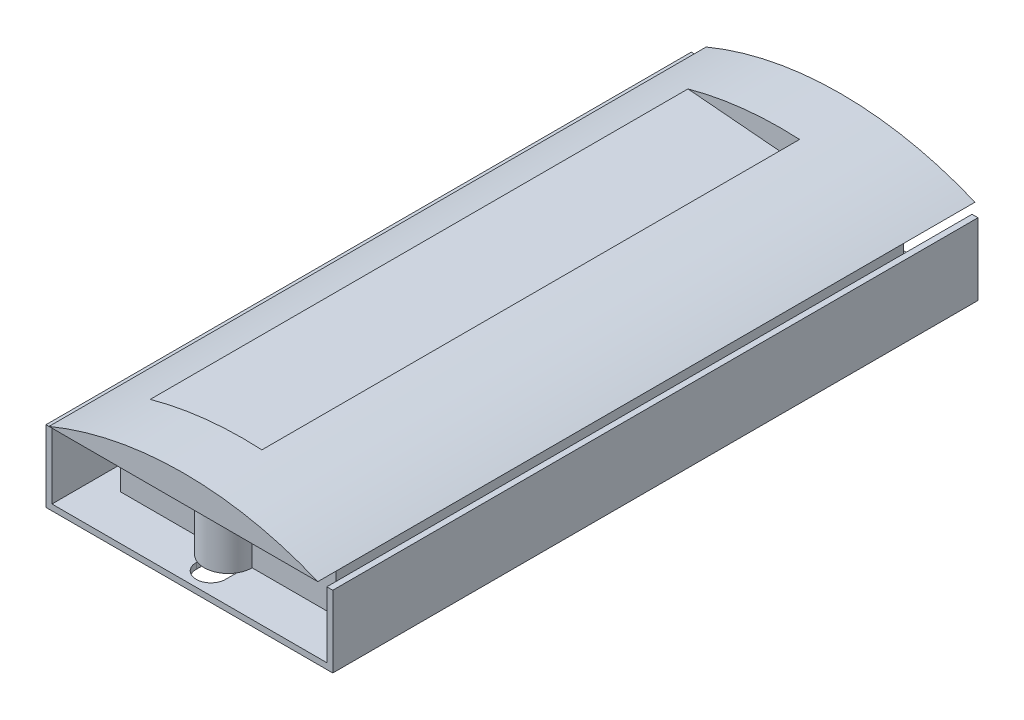
ISO-10303-21;
HEADER;
FILE_DESCRIPTION(('STEP AP214'),'2;1');
FILE_NAME('part.step','',(''),(''),'','','');
FILE_SCHEMA(('AUTOMOTIVE_DESIGN { 1 0 10303 214 1 1 1 1 }'));
ENDSEC;
DATA;
#1=APPLICATION_CONTEXT('core data for automotive mechanical design processes');
#2=APPLICATION_PROTOCOL_DEFINITION('international standard','automotive_design',2000,#1);
#3=PRODUCT_CONTEXT('',#1,'mechanical');
#4=PRODUCT('Part','Part','',(#3));
#5=PRODUCT_RELATED_PRODUCT_CATEGORY('part','',(#4));
#6=PRODUCT_DEFINITION_FORMATION('','',#4);
#7=PRODUCT_DEFINITION_CONTEXT('part definition',#1,'design');
#8=PRODUCT_DEFINITION('design','',#6,#7);
#9=PRODUCT_DEFINITION_SHAPE('','',#8);
#10=(LENGTH_UNIT() NAMED_UNIT(*) SI_UNIT(.MILLI.,.METRE.));
#11=(NAMED_UNIT(*) PLANE_ANGLE_UNIT() SI_UNIT($,.RADIAN.));
#12=(NAMED_UNIT(*) SI_UNIT($,.STERADIAN.) SOLID_ANGLE_UNIT());
#13=UNCERTAINTY_MEASURE_WITH_UNIT(LENGTH_MEASURE(1.E-05),#10,'distance_accuracy_value','');
#14=(GEOMETRIC_REPRESENTATION_CONTEXT(3) GLOBAL_UNCERTAINTY_ASSIGNED_CONTEXT((#13)) GLOBAL_UNIT_ASSIGNED_CONTEXT((#10,
#11,#12)) REPRESENTATION_CONTEXT('',''));
#15=CARTESIAN_POINT('',(0.,0.,0.));
#16=DIRECTION('',(0.,0.,1.));
#17=DIRECTION('',(1.,0.,0.));
#18=AXIS2_PLACEMENT_3D('',#15,#16,#17);
#19=CARTESIAN_POINT('',(0.,-13.,0.));
#20=DIRECTION('',(0.,1.,0.));
#21=DIRECTION('',(0.,0.,1.));
#22=AXIS2_PLACEMENT_3D('',#19,#20,#21);
#23=PLANE('',#22);
#24=CARTESIAN_POINT('',(22.5,-13.,4.6));
#25=DIRECTION('',(0.,-1.,0.));
#26=DIRECTION('',(0.,0.,-1.));
#27=AXIS2_PLACEMENT_3D('',#24,#25,#26);
#28=CIRCLE('',#27,2.45);
#29=CARTESIAN_POINT('',(20.05,-13.,4.6));
#30=VERTEX_POINT('',#29);
#31=CARTESIAN_POINT('',(24.95,-13.,4.60000000000001));
#32=VERTEX_POINT('',#31);
#33=EDGE_CURVE('E245',#30,#32,#28,.T.);
#34=ORIENTED_EDGE('',*,*,#33,.F.);
#35=DIRECTION('',(0.,0.,-1.));
#36=VECTOR('',#35,1.);
#37=CARTESIAN_POINT('',(20.05,-13.,4.6));
#38=LINE('',#37,#36);
#39=CARTESIAN_POINT('',(20.05,-13.,10.4));
#40=VERTEX_POINT('',#39);
#41=EDGE_CURVE('E253',#40,#30,#38,.T.);
#42=ORIENTED_EDGE('',*,*,#41,.F.);
#43=CARTESIAN_POINT('',(22.5,-13.,10.4));
#44=DIRECTION('',(0.,-1.,0.));
#45=DIRECTION('',(0.,0.,-1.));
#46=AXIS2_PLACEMENT_3D('',#43,#44,#45);
#47=CIRCLE('',#46,2.45);
#48=CARTESIAN_POINT('',(24.95,-13.,10.4));
#49=VERTEX_POINT('',#48);
#50=EDGE_CURVE('E250',#49,#40,#47,.T.);
#51=ORIENTED_EDGE('',*,*,#50,.F.);
#52=DIRECTION('',(0.,0.,1.));
#53=VECTOR('',#52,1.);
#54=CARTESIAN_POINT('',(24.95,-13.,4.60000000000001));
#55=LINE('',#54,#53);
#56=EDGE_CURVE('E247',#32,#49,#55,.T.);
#57=ORIENTED_EDGE('',*,*,#56,.F.);
#58=EDGE_LOOP('',(#34,#42,#51,#57));
#59=FACE_BOUND('',#58,.T.);
#60=DIRECTION('',(1.,0.,0.));
#61=VECTOR('',#60,1.);
#62=CARTESIAN_POINT('',(46.5,-13.,1.00000000000001));
#63=LINE('',#62,#61);
#64=CARTESIAN_POINT('',(-1.50000000000002,-13.,1.00000000000001));
#65=VERTEX_POINT('',#64);
#66=CARTESIAN_POINT('',(46.5,-13.,1.00000000000001));
#67=VERTEX_POINT('',#66);
#68=EDGE_CURVE('E279',#65,#67,#63,.T.);
#69=ORIENTED_EDGE('',*,*,#68,.T.);
#70=DIRECTION('',(0.,0.,1.));
#71=VECTOR('',#70,1.);
#72=CARTESIAN_POINT('',(46.5,-13.,109.));
#73=LINE('',#72,#71);
#74=CARTESIAN_POINT('',(46.5,-13.,109.));
#75=VERTEX_POINT('',#74);
#76=EDGE_CURVE('E282',#67,#75,#73,.T.);
#77=ORIENTED_EDGE('',*,*,#76,.T.);
#78=DIRECTION('',(-1.,0.,0.));
#79=VECTOR('',#78,1.);
#80=CARTESIAN_POINT('',(46.5,-13.,109.));
#81=LINE('',#80,#79);
#82=CARTESIAN_POINT('',(-1.50000000000002,-13.,109.));
#83=VERTEX_POINT('',#82);
#84=EDGE_CURVE('E172',#75,#83,#81,.T.);
#85=ORIENTED_EDGE('',*,*,#84,.T.);
#86=DIRECTION('',(0.,0.,-1.));
#87=VECTOR('',#86,1.);
#88=CARTESIAN_POINT('',(-1.50000000000002,-13.,109.));
#89=LINE('',#88,#87);
#90=EDGE_CURVE('E276',#83,#65,#89,.T.);
#91=ORIENTED_EDGE('',*,*,#90,.T.);
#92=EDGE_LOOP('',(#69,#77,#85,#91));
#93=FACE_BOUND('',#92,.T.);
#94=CARTESIAN_POINT('',(22.5,-13.,105.4));
#95=DIRECTION('',(0.,-1.,0.));
#96=DIRECTION('',(0.,0.,1.));
#97=AXIS2_PLACEMENT_3D('',#94,#95,#96);
#98=CIRCLE('',#97,2.45);
#99=CARTESIAN_POINT('',(24.95,-13.,105.4));
#100=VERTEX_POINT('',#99);
#101=CARTESIAN_POINT('',(20.05,-13.,105.4));
#102=VERTEX_POINT('',#101);
#103=EDGE_CURVE('E216',#100,#102,#98,.T.);
#104=ORIENTED_EDGE('',*,*,#103,.F.);
#105=DIRECTION('',(0.,0.,1.));
#106=VECTOR('',#105,1.);
#107=CARTESIAN_POINT('',(24.95,-13.,105.4));
#108=LINE('',#107,#106);
#109=CARTESIAN_POINT('',(24.95,-13.,99.6));
#110=VERTEX_POINT('',#109);
#111=EDGE_CURVE('E223',#110,#100,#108,.T.);
#112=ORIENTED_EDGE('',*,*,#111,.F.);
#113=CARTESIAN_POINT('',(22.5,-13.,99.6));
#114=DIRECTION('',(0.,-1.,0.));
#115=DIRECTION('',(0.,0.,1.));
#116=AXIS2_PLACEMENT_3D('',#113,#114,#115);
#117=CIRCLE('',#116,2.45);
#118=CARTESIAN_POINT('',(20.05,-13.,99.6));
#119=VERTEX_POINT('',#118);
#120=EDGE_CURVE('E221',#119,#110,#117,.T.);
#121=ORIENTED_EDGE('',*,*,#120,.F.);
#122=DIRECTION('',(0.,0.,-1.));
#123=VECTOR('',#122,1.);
#124=CARTESIAN_POINT('',(20.05,-13.,105.4));
#125=LINE('',#124,#123);
#126=EDGE_CURVE('E218',#102,#119,#125,.T.);
#127=ORIENTED_EDGE('',*,*,#126,.F.);
#128=EDGE_LOOP('',(#104,#112,#121,#127));
#129=FACE_BOUND('',#128,.T.);
#130=ADVANCED_FACE('F50',(#59,#93,#129),#23,.F.);
#131=CARTESIAN_POINT('',(0.,-12.,0.));
#132=DIRECTION('',(0.,1.,0.));
#133=DIRECTION('',(0.,0.,1.));
#134=AXIS2_PLACEMENT_3D('',#131,#132,#133);
#135=PLANE('',#134);
#136=DIRECTION('',(0.,0.,1.));
#137=VECTOR('',#136,1.);
#138=CARTESIAN_POINT('',(45.5,-12.,0.));
#139=LINE('',#138,#137);
#140=CARTESIAN_POINT('',(45.5,-12.,1.00000000000001));
#141=VERTEX_POINT('',#140);
#142=CARTESIAN_POINT('',(45.5,-12.,109.));
#143=VERTEX_POINT('',#142);
#144=EDGE_CURVE('E197',#141,#143,#139,.T.);
#145=ORIENTED_EDGE('',*,*,#144,.F.);
#146=DIRECTION('',(1.,0.,0.));
#147=VECTOR('',#146,1.);
#148=CARTESIAN_POINT('',(46.5,-12.,1.00000000000001));
#149=LINE('',#148,#147);
#150=CARTESIAN_POINT('',(-0.500000000000014,-12.,1.00000000000001));
#151=VERTEX_POINT('',#150);
#152=EDGE_CURVE('E275',#151,#141,#149,.T.);
#153=ORIENTED_EDGE('',*,*,#152,.F.);
#154=DIRECTION('',(0.,0.,-1.));
#155=VECTOR('',#154,1.);
#156=CARTESIAN_POINT('',(-0.500000000000015,-12.,0.));
#157=LINE('',#156,#155);
#158=CARTESIAN_POINT('',(-0.500000000000015,-12.,109.));
#159=VERTEX_POINT('',#158);
#160=EDGE_CURVE('E204',#159,#151,#157,.T.);
#161=ORIENTED_EDGE('',*,*,#160,.F.);
#162=DIRECTION('',(-1.,0.,0.));
#163=VECTOR('',#162,1.);
#164=CARTESIAN_POINT('',(46.5,-12.,109.));
#165=LINE('',#164,#163);
#166=EDGE_CURVE('E280',#143,#159,#165,.T.);
#167=ORIENTED_EDGE('',*,*,#166,.F.);
#168=EDGE_LOOP('',(#145,#153,#161,#167));
#169=FACE_BOUND('',#168,.T.);
#170=DIRECTION('',(0.,0.,-1.));
#171=VECTOR('',#170,1.);
#172=CARTESIAN_POINT('',(20.05,-12.,4.6));
#173=LINE('',#172,#171);
#174=CARTESIAN_POINT('',(20.05,-12.,10.4));
#175=VERTEX_POINT('',#174);
#176=CARTESIAN_POINT('',(20.05,-12.,4.6));
#177=VERTEX_POINT('',#176);
#178=EDGE_CURVE('E248',#175,#177,#173,.T.);
#179=ORIENTED_EDGE('',*,*,#178,.T.);
#180=CARTESIAN_POINT('',(22.5,-12.,4.6));
#181=DIRECTION('',(0.,-1.,0.));
#182=DIRECTION('',(0.,0.,-1.));
#183=AXIS2_PLACEMENT_3D('',#180,#181,#182);
#184=CIRCLE('',#183,2.45);
#185=CARTESIAN_POINT('',(24.95,-12.,4.60000000000001));
#186=VERTEX_POINT('',#185);
#187=EDGE_CURVE('E244',#177,#186,#184,.T.);
#188=ORIENTED_EDGE('',*,*,#187,.T.);
#189=DIRECTION('',(0.,0.,1.));
#190=VECTOR('',#189,1.);
#191=CARTESIAN_POINT('',(24.95,-12.,4.60000000000001));
#192=LINE('',#191,#190);
#193=CARTESIAN_POINT('',(24.95,-12.,10.4));
#194=VERTEX_POINT('',#193);
#195=EDGE_CURVE('E258',#186,#194,#192,.T.);
#196=ORIENTED_EDGE('',*,*,#195,.T.);
#197=CARTESIAN_POINT('',(22.5,-12.,10.4));
#198=DIRECTION('',(0.,-1.,0.));
#199=DIRECTION('',(0.,0.,-1.));
#200=AXIS2_PLACEMENT_3D('',#197,#198,#199);
#201=CIRCLE('',#200,2.45);
#202=EDGE_CURVE('E261',#194,#175,#201,.T.);
#203=ORIENTED_EDGE('',*,*,#202,.T.);
#204=EDGE_LOOP('',(#179,#188,#196,#203));
#205=FACE_BOUND('',#204,.T.);
#206=DIRECTION('',(0.,0.,1.));
#207=VECTOR('',#206,1.);
#208=CARTESIAN_POINT('',(24.95,-12.,105.4));
#209=LINE('',#208,#207);
#210=CARTESIAN_POINT('',(24.95,-12.,99.6));
#211=VERTEX_POINT('',#210);
#212=CARTESIAN_POINT('',(24.95,-12.,105.4));
#213=VERTEX_POINT('',#212);
#214=EDGE_CURVE('E219',#211,#213,#209,.T.);
#215=ORIENTED_EDGE('',*,*,#214,.T.);
#216=CARTESIAN_POINT('',(22.5,-12.,105.4));
#217=DIRECTION('',(0.,-1.,0.));
#218=DIRECTION('',(0.,0.,1.));
#219=AXIS2_PLACEMENT_3D('',#216,#217,#218);
#220=CIRCLE('',#219,2.45);
#221=CARTESIAN_POINT('',(20.05,-12.,105.4));
#222=VERTEX_POINT('',#221);
#223=EDGE_CURVE('E215',#213,#222,#220,.T.);
#224=ORIENTED_EDGE('',*,*,#223,.T.);
#225=DIRECTION('',(0.,0.,-1.));
#226=VECTOR('',#225,1.);
#227=CARTESIAN_POINT('',(20.05,-12.,105.4));
#228=LINE('',#227,#226);
#229=CARTESIAN_POINT('',(20.05,-12.,99.6));
#230=VERTEX_POINT('',#229);
#231=EDGE_CURVE('E228',#222,#230,#228,.T.);
#232=ORIENTED_EDGE('',*,*,#231,.T.);
#233=CARTESIAN_POINT('',(22.5,-12.,99.6));
#234=DIRECTION('',(0.,-1.,0.));
#235=DIRECTION('',(0.,0.,1.));
#236=AXIS2_PLACEMENT_3D('',#233,#234,#235);
#237=CIRCLE('',#236,2.45);
#238=EDGE_CURVE('E231',#230,#211,#237,.T.);
#239=ORIENTED_EDGE('',*,*,#238,.T.);
#240=EDGE_LOOP('',(#215,#224,#232,#239));
#241=FACE_BOUND('',#240,.T.);
#242=ADVANCED_FACE('F304',(#169,#205,#241),#135,.T.);
#243=CARTESIAN_POINT('',(-1.50000000000002,-13.,109.));
#244=DIRECTION('',(1.,0.,0.));
#245=DIRECTION('',(0.,0.,-1.));
#246=AXIS2_PLACEMENT_3D('',#243,#244,#245);
#247=PLANE('',#246);
#248=DIRECTION('',(0.,1.,0.));
#249=VECTOR('',#248,1.);
#250=CARTESIAN_POINT('',(-1.50000000000002,-13.,109.));
#251=LINE('',#250,#249);
#252=CARTESIAN_POINT('',(-1.50000000000002,-1.,109.));
#253=VERTEX_POINT('',#252);
#254=EDGE_CURVE('E175',#83,#253,#251,.T.);
#255=ORIENTED_EDGE('',*,*,#254,.T.);
#256=DIRECTION('',(0.,0.,1.));
#257=VECTOR('',#256,1.);
#258=CARTESIAN_POINT('',(-1.50000000000002,-1.,-11.0415945787923));
#259=LINE('',#258,#257);
#260=CARTESIAN_POINT('',(-1.50000000000002,-1.,1.00000000000001));
#261=VERTEX_POINT('',#260);
#262=EDGE_CURVE('E202',#261,#253,#259,.T.);
#263=ORIENTED_EDGE('',*,*,#262,.F.);
#264=DIRECTION('',(0.,1.,0.));
#265=VECTOR('',#264,1.);
#266=CARTESIAN_POINT('',(-1.50000000000002,-13.,1.00000000000001));
#267=LINE('',#266,#265);
#268=EDGE_CURVE('E12',#65,#261,#267,.T.);
#269=ORIENTED_EDGE('',*,*,#268,.F.);
#270=ORIENTED_EDGE('',*,*,#90,.F.);
#271=EDGE_LOOP('',(#255,#263,#269,#270));
#272=FACE_BOUND('',#271,.T.);
#273=ADVANCED_FACE('F52',(#272),#247,.F.);
#274=CARTESIAN_POINT('',(46.5,-13.,1.00000000000001));
#275=DIRECTION('',(0.,0.,1.));
#276=DIRECTION('',(1.,0.,0.));
#277=AXIS2_PLACEMENT_3D('',#274,#275,#276);
#278=PLANE('',#277);
#279=ORIENTED_EDGE('',*,*,#152,.T.);
#280=DIRECTION('',(0.,1.,0.));
#281=VECTOR('',#280,1.);
#282=CARTESIAN_POINT('',(45.5,-13.,1.00000000000001));
#283=LINE('',#282,#281);
#284=CARTESIAN_POINT('',(45.5,-0.999999999999995,1.00000000000001));
#285=VERTEX_POINT('',#284);
#286=EDGE_CURVE('E192',#141,#285,#283,.T.);
#287=ORIENTED_EDGE('',*,*,#286,.T.);
#288=DIRECTION('',(1.,0.,0.));
#289=VECTOR('',#288,1.);
#290=CARTESIAN_POINT('',(46.5,-0.999999999999995,1.00000000000001));
#291=LINE('',#290,#289);
#292=CARTESIAN_POINT('',(46.5,-0.999999999999995,1.00000000000001));
#293=VERTEX_POINT('',#292);
#294=EDGE_CURVE('E195',#285,#293,#291,.T.);
#295=ORIENTED_EDGE('',*,*,#294,.T.);
#296=DIRECTION('',(0.,1.,0.));
#297=VECTOR('',#296,1.);
#298=CARTESIAN_POINT('',(46.5,-13.,1.00000000000001));
#299=LINE('',#298,#297);
#300=EDGE_CURVE('E58',#67,#293,#299,.T.);
#301=ORIENTED_EDGE('',*,*,#300,.F.);
#302=ORIENTED_EDGE('',*,*,#68,.F.);
#303=ORIENTED_EDGE('',*,*,#268,.T.);
#304=DIRECTION('',(1.,0.,0.));
#305=VECTOR('',#304,1.);
#306=CARTESIAN_POINT('',(-1.50000000000002,-1.,1.00000000000001));
#307=LINE('',#306,#305);
#308=CARTESIAN_POINT('',(-0.500000000000015,-1.,1.00000000000001));
#309=VERTEX_POINT('',#308);
#310=EDGE_CURVE('E201',#261,#309,#307,.T.);
#311=ORIENTED_EDGE('',*,*,#310,.T.);
#312=DIRECTION('',(0.,-1.,0.));
#313=VECTOR('',#312,1.);
#314=CARTESIAN_POINT('',(-0.500000000000015,-13.,1.00000000000001));
#315=LINE('',#314,#313);
#316=EDGE_CURVE('E65',#309,#151,#315,.T.);
#317=ORIENTED_EDGE('',*,*,#316,.T.);
#318=EDGE_LOOP('',(#279,#287,#295,#301,#302,#303,#311,#317));
#319=FACE_BOUND('',#318,.T.);
#320=ADVANCED_FACE('F306',(#319),#278,.F.);
#321=CARTESIAN_POINT('',(46.5,-13.,109.));
#322=DIRECTION('',(-1.,0.,0.));
#323=DIRECTION('',(0.,0.,1.));
#324=AXIS2_PLACEMENT_3D('',#321,#322,#323);
#325=PLANE('',#324);
#326=ORIENTED_EDGE('',*,*,#300,.T.);
#327=DIRECTION('',(0.,0.,1.));
#328=VECTOR('',#327,1.);
#329=CARTESIAN_POINT('',(46.5,-0.999999999999995,-11.0415945787923));
#330=LINE('',#329,#328);
#331=CARTESIAN_POINT('',(46.5,-0.999999999999995,109.));
#332=VERTEX_POINT('',#331);
#333=EDGE_CURVE('E178',#293,#332,#330,.T.);
#334=ORIENTED_EDGE('',*,*,#333,.T.);
#335=DIRECTION('',(0.,1.,0.));
#336=VECTOR('',#335,1.);
#337=CARTESIAN_POINT('',(46.5,-13.,109.));
#338=LINE('',#337,#336);
#339=EDGE_CURVE('E164',#75,#332,#338,.T.);
#340=ORIENTED_EDGE('',*,*,#339,.F.);
#341=ORIENTED_EDGE('',*,*,#76,.F.);
#342=EDGE_LOOP('',(#326,#334,#340,#341));
#343=FACE_BOUND('',#342,.T.);
#344=ADVANCED_FACE('F179',(#343),#325,.F.);
#345=CARTESIAN_POINT('',(46.5,-13.,109.));
#346=DIRECTION('',(0.,0.,-1.));
#347=DIRECTION('',(-1.,0.,0.));
#348=AXIS2_PLACEMENT_3D('',#345,#346,#347);
#349=PLANE('',#348);
#350=ORIENTED_EDGE('',*,*,#254,.F.);
#351=ORIENTED_EDGE('',*,*,#84,.F.);
#352=ORIENTED_EDGE('',*,*,#339,.T.);
#353=DIRECTION('',(-1.,0.,0.));
#354=VECTOR('',#353,1.);
#355=CARTESIAN_POINT('',(46.5,-0.999999999999995,109.));
#356=LINE('',#355,#354);
#357=CARTESIAN_POINT('',(45.5,-0.999999999999995,109.));
#358=VERTEX_POINT('',#357);
#359=EDGE_CURVE('E170',#332,#358,#356,.T.);
#360=ORIENTED_EDGE('',*,*,#359,.T.);
#361=DIRECTION('',(0.,-1.,0.));
#362=VECTOR('',#361,1.);
#363=CARTESIAN_POINT('',(45.5,-13.,109.));
#364=LINE('',#363,#362);
#365=EDGE_CURVE('E185',#358,#143,#364,.T.);
#366=ORIENTED_EDGE('',*,*,#365,.T.);
#367=ORIENTED_EDGE('',*,*,#166,.T.);
#368=DIRECTION('',(0.,1.,0.));
#369=VECTOR('',#368,1.);
#370=CARTESIAN_POINT('',(-0.500000000000015,-13.,109.));
#371=LINE('',#370,#369);
#372=CARTESIAN_POINT('',(-0.500000000000015,-1.,109.));
#373=VERTEX_POINT('',#372);
#374=EDGE_CURVE('E199',#159,#373,#371,.T.);
#375=ORIENTED_EDGE('',*,*,#374,.T.);
#376=DIRECTION('',(-1.,0.,0.));
#377=VECTOR('',#376,1.);
#378=CARTESIAN_POINT('',(-1.50000000000002,-1.,109.));
#379=LINE('',#378,#377);
#380=EDGE_CURVE('E206',#373,#253,#379,.T.);
#381=ORIENTED_EDGE('',*,*,#380,.T.);
#382=EDGE_LOOP('',(#350,#351,#352,#360,#366,#367,#375,#381));
#383=FACE_BOUND('',#382,.T.);
#384=ADVANCED_FACE('F167',(#383),#349,.F.);
#385=CARTESIAN_POINT('',(22.5,-13.,4.6));
#386=DIRECTION('',(0.,1.,0.));
#387=DIRECTION('',(0.,0.,1.));
#388=AXIS2_PLACEMENT_3D('',#385,#386,#387);
#389=CYLINDRICAL_SURFACE('',#388,2.45);
#390=ORIENTED_EDGE('',*,*,#187,.F.);
#391=DIRECTION('',(0.,1.,0.));
#392=VECTOR('',#391,1.);
#393=CARTESIAN_POINT('',(20.05,-13.,4.6));
#394=LINE('',#393,#392);
#395=EDGE_CURVE('E255',#30,#177,#394,.T.);
#396=ORIENTED_EDGE('',*,*,#395,.F.);
#397=ORIENTED_EDGE('',*,*,#33,.T.);
#398=DIRECTION('',(0.,1.,0.));
#399=VECTOR('',#398,1.);
#400=CARTESIAN_POINT('',(24.95,-13.,4.60000000000001));
#401=LINE('',#400,#399);
#402=EDGE_CURVE('E272',#32,#186,#401,.T.);
#403=ORIENTED_EDGE('',*,*,#402,.T.);
#404=EDGE_LOOP('',(#390,#396,#397,#403));
#405=FACE_BOUND('',#404,.T.);
#406=ADVANCED_FACE('F327',(#405),#389,.F.);
#407=CARTESIAN_POINT('',(24.95,-13.,4.60000000000001));
#408=DIRECTION('',(-1.,0.,0.));
#409=DIRECTION('',(0.,0.,1.));
#410=AXIS2_PLACEMENT_3D('',#407,#408,#409);
#411=PLANE('',#410);
#412=ORIENTED_EDGE('',*,*,#195,.F.);
#413=ORIENTED_EDGE('',*,*,#402,.F.);
#414=ORIENTED_EDGE('',*,*,#56,.T.);
#415=DIRECTION('',(0.,1.,0.));
#416=VECTOR('',#415,1.);
#417=CARTESIAN_POINT('',(24.95,-13.,10.4));
#418=LINE('',#417,#416);
#419=EDGE_CURVE('E270',#49,#194,#418,.T.);
#420=ORIENTED_EDGE('',*,*,#419,.T.);
#421=EDGE_LOOP('',(#412,#413,#414,#420));
#422=FACE_BOUND('',#421,.T.);
#423=ADVANCED_FACE('F408',(#422),#411,.T.);
#424=CARTESIAN_POINT('',(22.5,-13.,10.4));
#425=DIRECTION('',(0.,1.,0.));
#426=DIRECTION('',(0.,0.,1.));
#427=AXIS2_PLACEMENT_3D('',#424,#425,#426);
#428=CYLINDRICAL_SURFACE('',#427,2.45);
#429=ORIENTED_EDGE('',*,*,#202,.F.);
#430=ORIENTED_EDGE('',*,*,#419,.F.);
#431=ORIENTED_EDGE('',*,*,#50,.T.);
#432=DIRECTION('',(0.,1.,0.));
#433=VECTOR('',#432,1.);
#434=CARTESIAN_POINT('',(20.05,-13.,10.4));
#435=LINE('',#434,#433);
#436=EDGE_CURVE('E268',#40,#175,#435,.T.);
#437=ORIENTED_EDGE('',*,*,#436,.T.);
#438=EDGE_LOOP('',(#429,#430,#431,#437));
#439=FACE_BOUND('',#438,.T.);
#440=ADVANCED_FACE('F398',(#439),#428,.F.);
#441=CARTESIAN_POINT('',(20.05,-13.,4.6));
#442=DIRECTION('',(1.,0.,0.));
#443=DIRECTION('',(0.,0.,-1.));
#444=AXIS2_PLACEMENT_3D('',#441,#442,#443);
#445=PLANE('',#444);
#446=ORIENTED_EDGE('',*,*,#178,.F.);
#447=ORIENTED_EDGE('',*,*,#436,.F.);
#448=ORIENTED_EDGE('',*,*,#41,.T.);
#449=ORIENTED_EDGE('',*,*,#395,.T.);
#450=EDGE_LOOP('',(#446,#447,#448,#449));
#451=FACE_BOUND('',#450,.T.);
#452=ADVANCED_FACE('F388',(#451),#445,.T.);
#453=CARTESIAN_POINT('',(22.5,-13.,105.4));
#454=DIRECTION('',(0.,1.,0.));
#455=DIRECTION('',(0.,0.,1.));
#456=AXIS2_PLACEMENT_3D('',#453,#454,#455);
#457=CYLINDRICAL_SURFACE('',#456,2.45);
#458=ORIENTED_EDGE('',*,*,#223,.F.);
#459=DIRECTION('',(0.,1.,0.));
#460=VECTOR('',#459,1.);
#461=CARTESIAN_POINT('',(24.95,-13.,105.4));
#462=LINE('',#461,#460);
#463=EDGE_CURVE('E225',#100,#213,#462,.T.);
#464=ORIENTED_EDGE('',*,*,#463,.F.);
#465=ORIENTED_EDGE('',*,*,#103,.T.);
#466=DIRECTION('',(0.,1.,0.));
#467=VECTOR('',#466,1.);
#468=CARTESIAN_POINT('',(20.05,-13.,105.4));
#469=LINE('',#468,#467);
#470=EDGE_CURVE('E241',#102,#222,#469,.T.);
#471=ORIENTED_EDGE('',*,*,#470,.T.);
#472=EDGE_LOOP('',(#458,#464,#465,#471));
#473=FACE_BOUND('',#472,.T.);
#474=ADVANCED_FACE('F378',(#473),#457,.F.);
#475=CARTESIAN_POINT('',(20.05,-13.,105.4));
#476=DIRECTION('',(1.,0.,0.));
#477=DIRECTION('',(0.,0.,-1.));
#478=AXIS2_PLACEMENT_3D('',#475,#476,#477);
#479=PLANE('',#478);
#480=ORIENTED_EDGE('',*,*,#231,.F.);
#481=ORIENTED_EDGE('',*,*,#470,.F.);
#482=ORIENTED_EDGE('',*,*,#126,.T.);
#483=DIRECTION('',(0.,1.,0.));
#484=VECTOR('',#483,1.);
#485=CARTESIAN_POINT('',(20.05,-13.,99.6));
#486=LINE('',#485,#484);
#487=EDGE_CURVE('E239',#119,#230,#486,.T.);
#488=ORIENTED_EDGE('',*,*,#487,.T.);
#489=EDGE_LOOP('',(#480,#481,#482,#488));
#490=FACE_BOUND('',#489,.T.);
#491=ADVANCED_FACE('F368',(#490),#479,.T.);
#492=CARTESIAN_POINT('',(22.5,-13.,99.6));
#493=DIRECTION('',(0.,1.,0.));
#494=DIRECTION('',(0.,0.,1.));
#495=AXIS2_PLACEMENT_3D('',#492,#493,#494);
#496=CYLINDRICAL_SURFACE('',#495,2.45);
#497=ORIENTED_EDGE('',*,*,#238,.F.);
#498=ORIENTED_EDGE('',*,*,#487,.F.);
#499=ORIENTED_EDGE('',*,*,#120,.T.);
#500=DIRECTION('',(0.,1.,0.));
#501=VECTOR('',#500,1.);
#502=CARTESIAN_POINT('',(24.95,-13.,99.6));
#503=LINE('',#502,#501);
#504=EDGE_CURVE('E73',#110,#211,#503,.T.);
#505=ORIENTED_EDGE('',*,*,#504,.T.);
#506=EDGE_LOOP('',(#497,#498,#499,#505));
#507=FACE_BOUND('',#506,.T.);
#508=ADVANCED_FACE('F358',(#507),#496,.F.);
#509=CARTESIAN_POINT('',(24.95,-13.,105.4));
#510=DIRECTION('',(-1.,0.,0.));
#511=DIRECTION('',(0.,0.,1.));
#512=AXIS2_PLACEMENT_3D('',#509,#510,#511);
#513=PLANE('',#512);
#514=ORIENTED_EDGE('',*,*,#214,.F.);
#515=ORIENTED_EDGE('',*,*,#504,.F.);
#516=ORIENTED_EDGE('',*,*,#111,.T.);
#517=ORIENTED_EDGE('',*,*,#463,.T.);
#518=EDGE_LOOP('',(#514,#515,#516,#517));
#519=FACE_BOUND('',#518,.T.);
#520=ADVANCED_FACE('F353',(#519),#513,.T.);
#521=CARTESIAN_POINT('',(-1.50000000000002,-1.,-11.0415945787923));
#522=DIRECTION('',(0.,1.,0.));
#523=DIRECTION('',(0.,0.,1.));
#524=AXIS2_PLACEMENT_3D('',#521,#522,#523);
#525=PLANE('',#524);
#526=ORIENTED_EDGE('',*,*,#310,.F.);
#527=ORIENTED_EDGE('',*,*,#262,.T.);
#528=ORIENTED_EDGE('',*,*,#380,.F.);
#529=DIRECTION('',(0.,0.,1.));
#530=VECTOR('',#529,1.);
#531=CARTESIAN_POINT('',(-0.500000000000015,-1.,-11.0415945787923));
#532=LINE('',#531,#530);
#533=EDGE_CURVE('E209',#309,#373,#532,.T.);
#534=ORIENTED_EDGE('',*,*,#533,.F.);
#535=EDGE_LOOP('',(#526,#527,#528,#534));
#536=FACE_BOUND('',#535,.T.);
#537=ADVANCED_FACE('F294',(#536),#525,.T.);
#538=CARTESIAN_POINT('',(-0.500000000000015,-13.,-11.0415945787923));
#539=DIRECTION('',(1.,0.,0.));
#540=DIRECTION('',(0.,0.,-1.));
#541=AXIS2_PLACEMENT_3D('',#538,#539,#540);
#542=PLANE('',#541);
#543=ORIENTED_EDGE('',*,*,#374,.F.);
#544=ORIENTED_EDGE('',*,*,#160,.T.);
#545=ORIENTED_EDGE('',*,*,#316,.F.);
#546=ORIENTED_EDGE('',*,*,#533,.T.);
#547=EDGE_LOOP('',(#543,#544,#545,#546));
#548=FACE_BOUND('',#547,.T.);
#549=ADVANCED_FACE('F300',(#548),#542,.T.);
#550=CARTESIAN_POINT('',(45.5,-13.,-11.0415945787923));
#551=DIRECTION('',(-1.,0.,0.));
#552=DIRECTION('',(0.,0.,1.));
#553=AXIS2_PLACEMENT_3D('',#550,#551,#552);
#554=PLANE('',#553);
#555=ORIENTED_EDGE('',*,*,#286,.F.);
#556=ORIENTED_EDGE('',*,*,#144,.T.);
#557=ORIENTED_EDGE('',*,*,#365,.F.);
#558=DIRECTION('',(0.,0.,1.));
#559=VECTOR('',#558,1.);
#560=CARTESIAN_POINT('',(45.5,-0.999999999999995,-11.0415945787923));
#561=LINE('',#560,#559);
#562=EDGE_CURVE('E184',#285,#358,#561,.T.);
#563=ORIENTED_EDGE('',*,*,#562,.F.);
#564=EDGE_LOOP('',(#555,#556,#557,#563));
#565=FACE_BOUND('',#564,.T.);
#566=ADVANCED_FACE('F308',(#565),#554,.T.);
#567=CARTESIAN_POINT('',(46.5,-0.999999999999995,-11.0415945787923));
#568=DIRECTION('',(0.,1.,0.));
#569=DIRECTION('',(-1.,0.,0.));
#570=AXIS2_PLACEMENT_3D('',#567,#568,#569);
#571=PLANE('',#570);
#572=ORIENTED_EDGE('',*,*,#294,.F.);
#573=ORIENTED_EDGE('',*,*,#562,.T.);
#574=ORIENTED_EDGE('',*,*,#359,.F.);
#575=ORIENTED_EDGE('',*,*,#333,.F.);
#576=EDGE_LOOP('',(#572,#573,#574,#575));
#577=FACE_BOUND('',#576,.T.);
#578=ADVANCED_FACE('F187',(#577),#571,.T.);
#579=CLOSED_SHELL('',(#130,#242,#273,#320,#344,#384,#406,#423,#440,#452,#474,#491,#508,#520,
#537,#549,#566,#578));
#580=MANIFOLD_SOLID_BREP('B2',#579);
#581=CARTESIAN_POINT('',(22.5,-54.,110.));
#582=DIRECTION('',(0.,0.,-1.));
#583=DIRECTION('',(-1.,0.,0.));
#584=AXIS2_PLACEMENT_3D('',#581,#582,#583);
#585=CYLINDRICAL_SURFACE('',#584,58.5);
#586=CARTESIAN_POINT('',(22.5,-54.,0.));
#587=DIRECTION('',(0.,0.,1.));
#588=DIRECTION('',(-1.,0.,0.));
#589=AXIS2_PLACEMENT_3D('',#586,#587,#588);
#590=CIRCLE('',#589,58.5);
#591=CARTESIAN_POINT('',(45.,0.,0.));
#592=VERTEX_POINT('',#591);
#593=CARTESIAN_POINT('',(0.,0.,0.));
#594=VERTEX_POINT('',#593);
#595=EDGE_CURVE('E700',#592,#594,#590,.T.);
#596=ORIENTED_EDGE('',*,*,#595,.T.);
#597=DIRECTION('',(0.,0.,-1.));
#598=VECTOR('',#597,1.);
#599=CARTESIAN_POINT('',(0.,0.,110.));
#600=LINE('',#599,#598);
#601=CARTESIAN_POINT('',(0.,0.,110.));
#602=VERTEX_POINT('',#601);
#603=EDGE_CURVE('E613',#602,#594,#600,.T.);
#604=ORIENTED_EDGE('',*,*,#603,.F.);
#605=CARTESIAN_POINT('',(22.5,-54.,110.));
#606=DIRECTION('',(0.,0.,1.));
#607=DIRECTION('',(-1.,0.,0.));
#608=AXIS2_PLACEMENT_3D('',#605,#606,#607);
#609=CIRCLE('',#608,58.5);
#610=CARTESIAN_POINT('',(45.,0.,110.));
#611=VERTEX_POINT('',#610);
#612=EDGE_CURVE('E701',#611,#602,#609,.T.);
#613=ORIENTED_EDGE('',*,*,#612,.F.);
#614=DIRECTION('',(0.,0.,-1.));
#615=VECTOR('',#614,1.);
#616=CARTESIAN_POINT('',(45.,0.,110.));
#617=LINE('',#616,#615);
#618=EDGE_CURVE('E707',#611,#592,#617,.T.);
#619=ORIENTED_EDGE('',*,*,#618,.T.);
#620=EDGE_LOOP('',(#596,#604,#613,#619));
#621=FACE_BOUND('',#620,.T.);
#622=CARTESIAN_POINT('',(22.5,-54.,9.99999999999999));
#623=DIRECTION('',(0.,0.,1.));
#624=DIRECTION('',(1.,0.,0.));
#625=AXIS2_PLACEMENT_3D('',#622,#623,#624);
#626=CIRCLE('',#625,58.5);
#627=CARTESIAN_POINT('',(25.6355375998647,4.415908825934,10.));
#628=VERTEX_POINT('',#627);
#629=CARTESIAN_POINT('',(6.95185149151565,2.39596685897064,9.99999999999999));
#630=VERTEX_POINT('',#629);
#631=EDGE_CURVE('E48',#628,#630,#626,.T.);
#632=ORIENTED_EDGE('',*,*,#631,.F.);
#633=DIRECTION('',(0.,0.,1.));
#634=VECTOR('',#633,1.);
#635=CARTESIAN_POINT('',(25.6355375998647,4.415908825934,10.));
#636=LINE('',#635,#634);
#637=CARTESIAN_POINT('',(25.6355375998647,4.415908825934,100.));
#638=VERTEX_POINT('',#637);
#639=EDGE_CURVE('E618',#628,#638,#636,.T.);
#640=ORIENTED_EDGE('',*,*,#639,.T.);
#641=CARTESIAN_POINT('',(22.5,-54.,100.));
#642=DIRECTION('',(0.,0.,1.));
#643=DIRECTION('',(1.,0.,0.));
#644=AXIS2_PLACEMENT_3D('',#641,#642,#643);
#645=CIRCLE('',#644,58.5);
#646=CARTESIAN_POINT('',(6.95185149151565,2.39596685897064,100.));
#647=VERTEX_POINT('',#646);
#648=EDGE_CURVE('E606',#638,#647,#645,.T.);
#649=ORIENTED_EDGE('',*,*,#648,.T.);
#650=DIRECTION('',(0.,0.,-1.));
#651=VECTOR('',#650,1.);
#652=CARTESIAN_POINT('',(6.95185149151565,2.39596685897064,110.));
#653=LINE('',#652,#651);
#654=EDGE_CURVE('E514',#630,#647,#653,.F.);
#655=ORIENTED_EDGE('',*,*,#654,.F.);
#656=EDGE_LOOP('',(#632,#640,#649,#655));
#657=FACE_BOUND('',#656,.T.);
#658=ADVANCED_FACE('F507',(#621,#657),#585,.T.);
#659=CARTESIAN_POINT('',(0.,0.,110.));
#660=DIRECTION('',(0.,1.,0.));
#661=DIRECTION('',(0.,0.,1.));
#662=AXIS2_PLACEMENT_3D('',#659,#660,#661);
#663=PLANE('',#662);
#664=DIRECTION('',(1.,0.,0.));
#665=VECTOR('',#664,1.);
#666=CARTESIAN_POINT('',(0.,0.,0.));
#667=LINE('',#666,#665);
#668=EDGE_CURVE('E705',#594,#592,#667,.T.);
#669=ORIENTED_EDGE('',*,*,#668,.T.);
#670=ORIENTED_EDGE('',*,*,#618,.F.);
#671=DIRECTION('',(1.,0.,0.));
#672=VECTOR('',#671,1.);
#673=CARTESIAN_POINT('',(0.,0.,110.));
#674=LINE('',#673,#672);
#675=EDGE_CURVE('E704',#602,#611,#674,.T.);
#676=ORIENTED_EDGE('',*,*,#675,.F.);
#677=ORIENTED_EDGE('',*,*,#603,.T.);
#678=EDGE_LOOP('',(#669,#670,#676,#677));
#679=FACE_BOUND('',#678,.T.);
#680=DIRECTION('',(1.,0.,0.));
#681=VECTOR('',#680,1.);
#682=CARTESIAN_POINT('',(0.,0.,7.50000000000001));
#683=LINE('',#682,#681);
#684=CARTESIAN_POINT('',(4.49999999999999,0.,7.50000000000001));
#685=VERTEX_POINT('',#684);
#686=CARTESIAN_POINT('',(18.5,0.,7.5));
#687=VERTEX_POINT('',#686);
#688=EDGE_CURVE('E637',#685,#687,#683,.T.);
#689=ORIENTED_EDGE('',*,*,#688,.F.);
#690=DIRECTION('',(0.,0.,1.));
#691=VECTOR('',#690,1.);
#692=CARTESIAN_POINT('',(4.49999999999999,0.,0.));
#693=LINE('',#692,#691);
#694=CARTESIAN_POINT('',(4.49999999999998,0.,102.5));
#695=VERTEX_POINT('',#694);
#696=EDGE_CURVE('E647',#685,#695,#693,.T.);
#697=ORIENTED_EDGE('',*,*,#696,.T.);
#698=DIRECTION('',(1.,0.,0.));
#699=VECTOR('',#698,1.);
#700=CARTESIAN_POINT('',(0.,0.,102.5));
#701=LINE('',#700,#699);
#702=CARTESIAN_POINT('',(18.5,0.,102.5));
#703=VERTEX_POINT('',#702);
#704=EDGE_CURVE('E529',#695,#703,#701,.T.);
#705=ORIENTED_EDGE('',*,*,#704,.T.);
#706=CARTESIAN_POINT('',(22.5,0.,102.5));
#707=DIRECTION('',(0.,-1.,0.));
#708=DIRECTION('',(0.,0.,-1.));
#709=AXIS2_PLACEMENT_3D('',#706,#707,#708);
#710=CIRCLE('',#709,4.);
#711=CARTESIAN_POINT('',(26.5,0.,102.5));
#712=VERTEX_POINT('',#711);
#713=EDGE_CURVE('E677',#712,#703,#710,.T.);
#714=ORIENTED_EDGE('',*,*,#713,.F.);
#715=DIRECTION('',(1.,0.,0.));
#716=VECTOR('',#715,1.);
#717=CARTESIAN_POINT('',(0.,0.,102.5));
#718=LINE('',#717,#716);
#719=CARTESIAN_POINT('',(40.5,0.,102.5));
#720=VERTEX_POINT('',#719);
#721=EDGE_CURVE('E674',#712,#720,#718,.T.);
#722=ORIENTED_EDGE('',*,*,#721,.T.);
#723=DIRECTION('',(0.,0.,1.));
#724=VECTOR('',#723,1.);
#725=CARTESIAN_POINT('',(40.5,0.,0.));
#726=LINE('',#725,#724);
#727=CARTESIAN_POINT('',(40.5,0.,7.5));
#728=VERTEX_POINT('',#727);
#729=EDGE_CURVE('E671',#728,#720,#726,.T.);
#730=ORIENTED_EDGE('',*,*,#729,.F.);
#731=DIRECTION('',(1.,0.,0.));
#732=VECTOR('',#731,1.);
#733=CARTESIAN_POINT('',(0.,0.,7.50000000000001));
#734=LINE('',#733,#732);
#735=CARTESIAN_POINT('',(26.5,0.,7.5));
#736=VERTEX_POINT('',#735);
#737=EDGE_CURVE('E669',#736,#728,#734,.T.);
#738=ORIENTED_EDGE('',*,*,#737,.F.);
#739=CARTESIAN_POINT('',(22.5,0.,7.50000000000002));
#740=DIRECTION('',(0.,-1.,0.));
#741=DIRECTION('',(0.,0.,-1.));
#742=AXIS2_PLACEMENT_3D('',#739,#740,#741);
#743=CIRCLE('',#742,4.);
#744=EDGE_CURVE('E667',#687,#736,#743,.T.);
#745=ORIENTED_EDGE('',*,*,#744,.F.);
#746=EDGE_LOOP('',(#689,#697,#705,#714,#722,#730,#738,#745));
#747=FACE_BOUND('',#746,.T.);
#748=ADVANCED_FACE('F742',(#679,#747),#663,.F.);
#749=CARTESIAN_POINT('',(22.5,-54.,110.));
#750=DIRECTION('',(0.,0.,-1.));
#751=DIRECTION('',(-1.,0.,0.));
#752=AXIS2_PLACEMENT_3D('',#749,#750,#751);
#753=PLANE('',#752);
#754=ORIENTED_EDGE('',*,*,#612,.T.);
#755=ORIENTED_EDGE('',*,*,#675,.T.);
#756=EDGE_LOOP('',(#754,#755));
#757=FACE_BOUND('',#756,.T.);
#758=ADVANCED_FACE('F747',(#757),#753,.F.);
#759=CARTESIAN_POINT('',(22.5,-54.,0.));
#760=DIRECTION('',(0.,0.,-1.));
#761=DIRECTION('',(-1.,0.,0.));
#762=AXIS2_PLACEMENT_3D('',#759,#760,#761);
#763=PLANE('',#762);
#764=ORIENTED_EDGE('',*,*,#595,.F.);
#765=ORIENTED_EDGE('',*,*,#668,.F.);
#766=EDGE_LOOP('',(#764,#765));
#767=FACE_BOUND('',#766,.T.);
#768=ADVANCED_FACE('F754',(#767),#763,.T.);
#769=CARTESIAN_POINT('',(0.,-11.,7.50000000000001));
#770=DIRECTION('',(0.,0.,1.));
#771=DIRECTION('',(1.,0.,0.));
#772=AXIS2_PLACEMENT_3D('',#769,#770,#771);
#773=PLANE('',#772);
#774=ORIENTED_EDGE('',*,*,#688,.T.);
#775=DIRECTION('',(0.,1.,0.));
#776=VECTOR('',#775,1.);
#777=CARTESIAN_POINT('',(18.5,-11.,7.5));
#778=LINE('',#777,#776);
#779=CARTESIAN_POINT('',(18.5,-11.,7.5));
#780=VERTEX_POINT('',#779);
#781=EDGE_CURVE('E698',#780,#687,#778,.T.);
#782=ORIENTED_EDGE('',*,*,#781,.F.);
#783=DIRECTION('',(1.,0.,0.));
#784=VECTOR('',#783,1.);
#785=CARTESIAN_POINT('',(0.,-11.,7.50000000000001));
#786=LINE('',#785,#784);
#787=CARTESIAN_POINT('',(4.49999999999999,-11.,7.50000000000001));
#788=VERTEX_POINT('',#787);
#789=EDGE_CURVE('E643',#788,#780,#786,.T.);
#790=ORIENTED_EDGE('',*,*,#789,.F.);
#791=DIRECTION('',(0.,1.,0.));
#792=VECTOR('',#791,1.);
#793=CARTESIAN_POINT('',(4.49999999999999,-11.,7.50000000000001));
#794=LINE('',#793,#792);
#795=EDGE_CURVE('E664',#788,#685,#794,.T.);
#796=ORIENTED_EDGE('',*,*,#795,.T.);
#797=EDGE_LOOP('',(#774,#782,#790,#796));
#798=FACE_BOUND('',#797,.T.);
#799=ADVANCED_FACE('F762',(#798),#773,.F.);
#800=CARTESIAN_POINT('',(22.5,-11.,7.50000000000002));
#801=DIRECTION('',(0.,1.,0.));
#802=DIRECTION('',(0.,0.,1.));
#803=AXIS2_PLACEMENT_3D('',#800,#801,#802);
#804=CYLINDRICAL_SURFACE('',#803,4.);
#805=ORIENTED_EDGE('',*,*,#744,.T.);
#806=DIRECTION('',(0.,1.,0.));
#807=VECTOR('',#806,1.);
#808=CARTESIAN_POINT('',(26.5,-11.,7.5));
#809=LINE('',#808,#807);
#810=CARTESIAN_POINT('',(26.5,-11.,7.5));
#811=VERTEX_POINT('',#810);
#812=EDGE_CURVE('E695',#811,#736,#809,.T.);
#813=ORIENTED_EDGE('',*,*,#812,.F.);
#814=CARTESIAN_POINT('',(22.5,-11.,7.50000000000002));
#815=DIRECTION('',(0.,-1.,0.));
#816=DIRECTION('',(0.,0.,-1.));
#817=AXIS2_PLACEMENT_3D('',#814,#815,#816);
#818=CIRCLE('',#817,4.);
#819=EDGE_CURVE('E646',#780,#811,#818,.T.);
#820=ORIENTED_EDGE('',*,*,#819,.F.);
#821=ORIENTED_EDGE('',*,*,#781,.T.);
#822=EDGE_LOOP('',(#805,#813,#820,#821));
#823=FACE_BOUND('',#822,.T.);
#824=ADVANCED_FACE('F767',(#823),#804,.T.);
#825=CARTESIAN_POINT('',(0.,-11.,7.50000000000001));
#826=DIRECTION('',(0.,0.,1.));
#827=DIRECTION('',(1.,0.,0.));
#828=AXIS2_PLACEMENT_3D('',#825,#826,#827);
#829=PLANE('',#828);
#830=ORIENTED_EDGE('',*,*,#737,.T.);
#831=DIRECTION('',(0.,1.,0.));
#832=VECTOR('',#831,1.);
#833=CARTESIAN_POINT('',(40.5,-11.,7.5));
#834=LINE('',#833,#832);
#835=CARTESIAN_POINT('',(40.5,-11.,7.5));
#836=VERTEX_POINT('',#835);
#837=EDGE_CURVE('E692',#836,#728,#834,.T.);
#838=ORIENTED_EDGE('',*,*,#837,.F.);
#839=DIRECTION('',(1.,0.,0.));
#840=VECTOR('',#839,1.);
#841=CARTESIAN_POINT('',(0.,-11.,7.50000000000001));
#842=LINE('',#841,#840);
#843=EDGE_CURVE('E649',#811,#836,#842,.T.);
#844=ORIENTED_EDGE('',*,*,#843,.F.);
#845=ORIENTED_EDGE('',*,*,#812,.T.);
#846=EDGE_LOOP('',(#830,#838,#844,#845));
#847=FACE_BOUND('',#846,.T.);
#848=ADVANCED_FACE('F771',(#847),#829,.F.);
#849=CARTESIAN_POINT('',(40.5,-11.,0.));
#850=DIRECTION('',(-1.,0.,0.));
#851=DIRECTION('',(0.,0.,1.));
#852=AXIS2_PLACEMENT_3D('',#849,#850,#851);
#853=PLANE('',#852);
#854=ORIENTED_EDGE('',*,*,#729,.T.);
#855=DIRECTION('',(0.,1.,0.));
#856=VECTOR('',#855,1.);
#857=CARTESIAN_POINT('',(40.5,-11.,102.5));
#858=LINE('',#857,#856);
#859=CARTESIAN_POINT('',(40.5,-11.,102.5));
#860=VERTEX_POINT('',#859);
#861=EDGE_CURVE('E690',#860,#720,#858,.T.);
#862=ORIENTED_EDGE('',*,*,#861,.F.);
#863=DIRECTION('',(0.,0.,1.));
#864=VECTOR('',#863,1.);
#865=CARTESIAN_POINT('',(40.5,-11.,0.));
#866=LINE('',#865,#864);
#867=EDGE_CURVE('E651',#836,#860,#866,.T.);
#868=ORIENTED_EDGE('',*,*,#867,.F.);
#869=ORIENTED_EDGE('',*,*,#837,.T.);
#870=EDGE_LOOP('',(#854,#862,#868,#869));
#871=FACE_BOUND('',#870,.T.);
#872=ADVANCED_FACE('F775',(#871),#853,.F.);
#873=CARTESIAN_POINT('',(0.,-11.,102.5));
#874=DIRECTION('',(0.,0.,1.));
#875=DIRECTION('',(1.,0.,0.));
#876=AXIS2_PLACEMENT_3D('',#873,#874,#875);
#877=PLANE('',#876);
#878=ORIENTED_EDGE('',*,*,#721,.F.);
#879=DIRECTION('',(0.,1.,0.));
#880=VECTOR('',#879,1.);
#881=CARTESIAN_POINT('',(26.5,-11.,102.5));
#882=LINE('',#881,#880);
#883=CARTESIAN_POINT('',(26.5,-11.,102.5));
#884=VERTEX_POINT('',#883);
#885=EDGE_CURVE('E688',#884,#712,#882,.T.);
#886=ORIENTED_EDGE('',*,*,#885,.F.);
#887=DIRECTION('',(1.,0.,0.));
#888=VECTOR('',#887,1.);
#889=CARTESIAN_POINT('',(0.,-11.,102.5));
#890=LINE('',#889,#888);
#891=EDGE_CURVE('E653',#884,#860,#890,.T.);
#892=ORIENTED_EDGE('',*,*,#891,.T.);
#893=ORIENTED_EDGE('',*,*,#861,.T.);
#894=EDGE_LOOP('',(#878,#886,#892,#893));
#895=FACE_BOUND('',#894,.T.);
#896=ADVANCED_FACE('F779',(#895),#877,.T.);
#897=CARTESIAN_POINT('',(22.5,-11.,102.5));
#898=DIRECTION('',(0.,1.,0.));
#899=DIRECTION('',(0.,0.,1.));
#900=AXIS2_PLACEMENT_3D('',#897,#898,#899);
#901=CYLINDRICAL_SURFACE('',#900,4.);
#902=ORIENTED_EDGE('',*,*,#713,.T.);
#903=DIRECTION('',(0.,1.,0.));
#904=VECTOR('',#903,1.);
#905=CARTESIAN_POINT('',(18.5,-11.,102.5));
#906=LINE('',#905,#904);
#907=CARTESIAN_POINT('',(18.5,-11.,102.5));
#908=VERTEX_POINT('',#907);
#909=EDGE_CURVE('E686',#908,#703,#906,.T.);
#910=ORIENTED_EDGE('',*,*,#909,.F.);
#911=CARTESIAN_POINT('',(22.5,-11.,102.5));
#912=DIRECTION('',(0.,-1.,0.));
#913=DIRECTION('',(0.,0.,-1.));
#914=AXIS2_PLACEMENT_3D('',#911,#912,#913);
#915=CIRCLE('',#914,4.);
#916=EDGE_CURVE('E656',#884,#908,#915,.T.);
#917=ORIENTED_EDGE('',*,*,#916,.F.);
#918=ORIENTED_EDGE('',*,*,#885,.T.);
#919=EDGE_LOOP('',(#902,#910,#917,#918));
#920=FACE_BOUND('',#919,.T.);
#921=ADVANCED_FACE('F783',(#920),#901,.T.);
#922=CARTESIAN_POINT('',(0.,-11.,102.5));
#923=DIRECTION('',(0.,0.,1.));
#924=DIRECTION('',(1.,0.,0.));
#925=AXIS2_PLACEMENT_3D('',#922,#923,#924);
#926=PLANE('',#925);
#927=ORIENTED_EDGE('',*,*,#704,.F.);
#928=DIRECTION('',(0.,1.,0.));
#929=VECTOR('',#928,1.);
#930=CARTESIAN_POINT('',(4.49999999999998,-11.,102.5));
#931=LINE('',#930,#929);
#932=CARTESIAN_POINT('',(4.49999999999998,-11.,102.5));
#933=VERTEX_POINT('',#932);
#934=EDGE_CURVE('E684',#933,#695,#931,.T.);
#935=ORIENTED_EDGE('',*,*,#934,.F.);
#936=DIRECTION('',(1.,0.,0.));
#937=VECTOR('',#936,1.);
#938=CARTESIAN_POINT('',(0.,-11.,102.5));
#939=LINE('',#938,#937);
#940=EDGE_CURVE('E658',#933,#908,#939,.T.);
#941=ORIENTED_EDGE('',*,*,#940,.T.);
#942=ORIENTED_EDGE('',*,*,#909,.T.);
#943=EDGE_LOOP('',(#927,#935,#941,#942));
#944=FACE_BOUND('',#943,.T.);
#945=ADVANCED_FACE('F787',(#944),#926,.T.);
#946=CARTESIAN_POINT('',(4.49999999999999,-11.,0.));
#947=DIRECTION('',(-1.,0.,0.));
#948=DIRECTION('',(0.,0.,1.));
#949=AXIS2_PLACEMENT_3D('',#946,#947,#948);
#950=PLANE('',#949);
#951=ORIENTED_EDGE('',*,*,#696,.F.);
#952=ORIENTED_EDGE('',*,*,#795,.F.);
#953=DIRECTION('',(0.,0.,1.));
#954=VECTOR('',#953,1.);
#955=CARTESIAN_POINT('',(4.49999999999999,-11.,0.));
#956=LINE('',#955,#954);
#957=EDGE_CURVE('E661',#788,#933,#956,.T.);
#958=ORIENTED_EDGE('',*,*,#957,.T.);
#959=ORIENTED_EDGE('',*,*,#934,.T.);
#960=EDGE_LOOP('',(#951,#952,#958,#959));
#961=FACE_BOUND('',#960,.T.);
#962=ADVANCED_FACE('F791',(#961),#950,.T.);
#963=CARTESIAN_POINT('',(0.,-11.,0.));
#964=DIRECTION('',(0.,-1.,0.));
#965=DIRECTION('',(0.,0.,-1.));
#966=AXIS2_PLACEMENT_3D('',#963,#964,#965);
#967=PLANE('',#966);
#968=CARTESIAN_POINT('',(22.5,-11.,102.5));
#969=DIRECTION('',(0.,-1.,0.));
#970=DIRECTION('',(0.,0.,-1.));
#971=AXIS2_PLACEMENT_3D('',#968,#969,#970);
#972=CIRCLE('',#971,1.6);
#973=CARTESIAN_POINT('',(22.5,-11.,100.9));
#974=VERTEX_POINT('',#973);
#975=EDGE_CURVE('E638',#974,#974,#972,.T.);
#976=ORIENTED_EDGE('',*,*,#975,.F.);
#977=EDGE_LOOP('',(#976));
#978=FACE_BOUND('',#977,.T.);
#979=CARTESIAN_POINT('',(22.5,-11.,7.50000000000002));
#980=DIRECTION('',(0.,-1.,0.));
#981=DIRECTION('',(0.,0.,-1.));
#982=AXIS2_PLACEMENT_3D('',#979,#980,#981);
#983=CIRCLE('',#982,1.6);
#984=CARTESIAN_POINT('',(22.5,-11.,5.90000000000002));
#985=VERTEX_POINT('',#984);
#986=EDGE_CURVE('E625',#985,#985,#983,.T.);
#987=ORIENTED_EDGE('',*,*,#986,.F.);
#988=EDGE_LOOP('',(#987));
#989=FACE_BOUND('',#988,.T.);
#990=ORIENTED_EDGE('',*,*,#789,.T.);
#991=ORIENTED_EDGE('',*,*,#819,.T.);
#992=ORIENTED_EDGE('',*,*,#843,.T.);
#993=ORIENTED_EDGE('',*,*,#867,.T.);
#994=ORIENTED_EDGE('',*,*,#891,.F.);
#995=ORIENTED_EDGE('',*,*,#916,.T.);
#996=ORIENTED_EDGE('',*,*,#940,.F.);
#997=ORIENTED_EDGE('',*,*,#957,.F.);
#998=EDGE_LOOP('',(#990,#991,#992,#993,#994,#995,#996,#997));
#999=FACE_BOUND('',#998,.T.);
#1000=ADVANCED_FACE('F794',(#978,#989,#999),#967,.T.);
#1001=CARTESIAN_POINT('',(22.5,0.,7.50000000000002));
#1002=DIRECTION('',(0.,-1.,0.));
#1003=DIRECTION('',(0.,0.,-1.));
#1004=AXIS2_PLACEMENT_3D('',#1001,#1002,#1003);
#1005=CYLINDRICAL_SURFACE('',#1004,1.6);
#1006=CARTESIAN_POINT('',(22.5,0.,7.50000000000002));
#1007=DIRECTION('',(0.,-1.,0.));
#1008=DIRECTION('',(0.,0.,-1.));
#1009=AXIS2_PLACEMENT_3D('',#1006,#1007,#1008);
#1010=CIRCLE('',#1009,1.6);
#1011=CARTESIAN_POINT('',(22.5,0.,5.90000000000002));
#1012=VERTEX_POINT('',#1011);
#1013=EDGE_CURVE('E628',#1012,#1012,#1010,.T.);
#1014=ORIENTED_EDGE('',*,*,#1013,.F.);
#1015=EDGE_LOOP('',(#1014));
#1016=FACE_BOUND('',#1015,.T.);
#1017=ORIENTED_EDGE('',*,*,#986,.T.);
#1018=EDGE_LOOP('',(#1017));
#1019=FACE_BOUND('',#1018,.T.);
#1020=ADVANCED_FACE('F798',(#1016,#1019),#1005,.F.);
#1021=CARTESIAN_POINT('',(22.5,0.,7.50000000000002));
#1022=DIRECTION('',(0.,-1.,0.));
#1023=DIRECTION('',(0.,0.,-1.));
#1024=AXIS2_PLACEMENT_3D('',#1021,#1022,#1023);
#1025=PLANE('',#1024);
#1026=ORIENTED_EDGE('',*,*,#1013,.T.);
#1027=EDGE_LOOP('',(#1026));
#1028=FACE_BOUND('',#1027,.T.);
#1029=ADVANCED_FACE('F802',(#1028),#1025,.T.);
#1030=CARTESIAN_POINT('',(22.5,0.,102.5));
#1031=DIRECTION('',(0.,-1.,0.));
#1032=DIRECTION('',(0.,0.,-1.));
#1033=AXIS2_PLACEMENT_3D('',#1030,#1031,#1032);
#1034=CYLINDRICAL_SURFACE('',#1033,1.6);
#1035=CARTESIAN_POINT('',(22.5,0.,102.5));
#1036=DIRECTION('',(0.,-1.,0.));
#1037=DIRECTION('',(0.,0.,-1.));
#1038=AXIS2_PLACEMENT_3D('',#1035,#1036,#1037);
#1039=CIRCLE('',#1038,1.6);
#1040=CARTESIAN_POINT('',(22.5,0.,100.9));
#1041=VERTEX_POINT('',#1040);
#1042=EDGE_CURVE('E634',#1041,#1041,#1039,.T.);
#1043=ORIENTED_EDGE('',*,*,#1042,.F.);
#1044=EDGE_LOOP('',(#1043));
#1045=FACE_BOUND('',#1044,.T.);
#1046=ORIENTED_EDGE('',*,*,#975,.T.);
#1047=EDGE_LOOP('',(#1046));
#1048=FACE_BOUND('',#1047,.T.);
#1049=ADVANCED_FACE('F806',(#1045,#1048),#1034,.F.);
#1050=CARTESIAN_POINT('',(22.5,0.,102.5));
#1051=DIRECTION('',(0.,-1.,0.));
#1052=DIRECTION('',(0.,0.,-1.));
#1053=AXIS2_PLACEMENT_3D('',#1050,#1051,#1052);
#1054=PLANE('',#1053);
#1055=ORIENTED_EDGE('',*,*,#1042,.T.);
#1056=EDGE_LOOP('',(#1055));
#1057=FACE_BOUND('',#1056,.T.);
#1058=ADVANCED_FACE('F739',(#1057),#1054,.T.);
#1059=CARTESIAN_POINT('',(28.8796522942782,0.497190811804058,10.));
#1060=DIRECTION('',(0.086269350145016,0.996271850061797,0.));
#1061=DIRECTION('',(-0.996271850061798,0.086269350145016,0.));
#1062=AXIS2_PLACEMENT_3D('',#1059,#1060,#1061);
#1063=PLANE('',#1062);
#1064=ORIENTED_EDGE('',*,*,#654,.T.);
#1065=DIRECTION('',(-0.996271850061797,0.086269350145016,0.));
#1066=VECTOR('',#1065,1.);
#1067=CARTESIAN_POINT('',(28.8796522942782,0.497190811804058,100.));
#1068=LINE('',#1067,#1066);
#1069=CARTESIAN_POINT('',(28.8796522942782,0.497190811804057,100.));
#1070=VERTEX_POINT('',#1069);
#1071=EDGE_CURVE('E521',#1070,#647,#1068,.T.);
#1072=ORIENTED_EDGE('',*,*,#1071,.F.);
#1073=DIRECTION('',(0.,0.,1.));
#1074=VECTOR('',#1073,1.);
#1075=CARTESIAN_POINT('',(28.8796522942782,0.497190811804057,10.));
#1076=LINE('',#1075,#1074);
#1077=CARTESIAN_POINT('',(28.8796522942782,0.497190811804057,10.));
#1078=VERTEX_POINT('',#1077);
#1079=EDGE_CURVE('E630',#1078,#1070,#1076,.T.);
#1080=ORIENTED_EDGE('',*,*,#1079,.F.);
#1081=DIRECTION('',(-0.996271850061797,0.086269350145016,0.));
#1082=VECTOR('',#1081,1.);
#1083=CARTESIAN_POINT('',(28.8796522942782,0.497190811804058,10.));
#1084=LINE('',#1083,#1082);
#1085=EDGE_CURVE('E719',#1078,#630,#1084,.T.);
#1086=ORIENTED_EDGE('',*,*,#1085,.T.);
#1087=EDGE_LOOP('',(#1064,#1072,#1080,#1086));
#1088=FACE_BOUND('',#1087,.T.);
#1089=ADVANCED_FACE('F716',(#1088),#1063,.T.);
#1090=CARTESIAN_POINT('',(28.3547584944452,1.80605732164043,10.));
#1091=DIRECTION('',(0.,0.,1.));
#1092=DIRECTION('',(1.,0.,0.));
#1093=AXIS2_PLACEMENT_3D('',#1090,#1091,#1092);
#1094=PLANE('',#1093);
#1095=ORIENTED_EDGE('',*,*,#631,.T.);
#1096=ORIENTED_EDGE('',*,*,#1085,.F.);
#1097=CARTESIAN_POINT('',(28.3547584944452,1.80605732164043,10.));
#1098=DIRECTION('',(0.,0.,-1.));
#1099=DIRECTION('',(1.,0.,0.));
#1100=AXIS2_PLACEMENT_3D('',#1097,#1098,#1099);
#1101=CIRCLE('',#1100,1.41019326394447);
#1102=CARTESIAN_POINT('',(28.8796522942782,3.11492383147681,10.));
#1103=VERTEX_POINT('',#1102);
#1104=EDGE_CURVE('E722',#1103,#1078,#1101,.T.);
#1105=ORIENTED_EDGE('',*,*,#1104,.F.);
#1106=DIRECTION('',(0.928146902485783,-0.372214088134833,0.));
#1107=VECTOR('',#1106,1.);
#1108=CARTESIAN_POINT('',(25.6355375998647,4.415908825934,10.));
#1109=LINE('',#1108,#1107);
#1110=EDGE_CURVE('E724',#628,#1103,#1109,.T.);
#1111=ORIENTED_EDGE('',*,*,#1110,.F.);
#1112=EDGE_LOOP('',(#1095,#1096,#1105,#1111));
#1113=FACE_BOUND('',#1112,.T.);
#1114=ADVANCED_FACE('F731',(#1113),#1094,.T.);
#1115=CARTESIAN_POINT('',(28.3547584944452,1.80605732164043,100.));
#1116=DIRECTION('',(0.,0.,1.));
#1117=DIRECTION('',(1.,0.,0.));
#1118=AXIS2_PLACEMENT_3D('',#1115,#1116,#1117);
#1119=PLANE('',#1118);
#1120=DIRECTION('',(0.928146902485783,-0.372214088134833,0.));
#1121=VECTOR('',#1120,1.);
#1122=CARTESIAN_POINT('',(25.6355375998647,4.415908825934,100.));
#1123=LINE('',#1122,#1121);
#1124=CARTESIAN_POINT('',(28.8796522942782,3.11492383147681,100.));
#1125=VERTEX_POINT('',#1124);
#1126=EDGE_CURVE('E609',#638,#1125,#1123,.T.);
#1127=ORIENTED_EDGE('',*,*,#1126,.T.);
#1128=CARTESIAN_POINT('',(28.3547584944452,1.80605732164043,100.));
#1129=DIRECTION('',(0.,0.,-1.));
#1130=DIRECTION('',(1.,0.,0.));
#1131=AXIS2_PLACEMENT_3D('',#1128,#1129,#1130);
#1132=CIRCLE('',#1131,1.41019326394447);
#1133=EDGE_CURVE('E623',#1125,#1070,#1132,.T.);
#1134=ORIENTED_EDGE('',*,*,#1133,.T.);
#1135=ORIENTED_EDGE('',*,*,#1071,.T.);
#1136=ORIENTED_EDGE('',*,*,#648,.F.);
#1137=EDGE_LOOP('',(#1127,#1134,#1135,#1136));
#1138=FACE_BOUND('',#1137,.T.);
#1139=ADVANCED_FACE('F608',(#1138),#1119,.F.);
#1140=CARTESIAN_POINT('',(25.6355375998647,4.415908825934,10.));
#1141=DIRECTION('',(-0.372214088134833,-0.928146902485783,0.));
#1142=DIRECTION('',(0.928146902485784,-0.372214088134833,0.));
#1143=AXIS2_PLACEMENT_3D('',#1140,#1141,#1142);
#1144=PLANE('',#1143);
#1145=ORIENTED_EDGE('',*,*,#639,.F.);
#1146=ORIENTED_EDGE('',*,*,#1110,.T.);
#1147=DIRECTION('',(0.,0.,1.));
#1148=VECTOR('',#1147,1.);
#1149=CARTESIAN_POINT('',(28.8796522942782,3.11492383147681,10.));
#1150=LINE('',#1149,#1148);
#1151=EDGE_CURVE('E621',#1103,#1125,#1150,.T.);
#1152=ORIENTED_EDGE('',*,*,#1151,.T.);
#1153=ORIENTED_EDGE('',*,*,#1126,.F.);
#1154=EDGE_LOOP('',(#1145,#1146,#1152,#1153));
#1155=FACE_BOUND('',#1154,.T.);
#1156=ADVANCED_FACE('F617',(#1155),#1144,.T.);
#1157=CARTESIAN_POINT('',(28.3547584944452,1.80605732164043,10.));
#1158=DIRECTION('',(0.,0.,1.));
#1159=DIRECTION('',(1.,0.,0.));
#1160=AXIS2_PLACEMENT_3D('',#1157,#1158,#1159);
#1161=CYLINDRICAL_SURFACE('',#1160,1.41019326394447);
#1162=ORIENTED_EDGE('',*,*,#1151,.F.);
#1163=ORIENTED_EDGE('',*,*,#1104,.T.);
#1164=ORIENTED_EDGE('',*,*,#1079,.T.);
#1165=ORIENTED_EDGE('',*,*,#1133,.F.);
#1166=EDGE_LOOP('',(#1162,#1163,#1164,#1165));
#1167=FACE_BOUND('',#1166,.T.);
#1168=ADVANCED_FACE('F730',(#1167),#1161,.F.);
#1169=CLOSED_SHELL('',(#658,#748,#758,#768,#799,#824,#848,#872,#896,#921,#945,#962,#1000,#1020,
#1029,#1049,#1058,#1089,#1114,#1139,#1156,#1168));
#1170=MANIFOLD_SOLID_BREP('B6',#1169);
#1171=ADVANCED_BREP_SHAPE_REPRESENTATION('',(#18,#580,#1170),#14);
#1172=SHAPE_DEFINITION_REPRESENTATION(#9,#1171);
ENDSEC;
END-ISO-10303-21;
